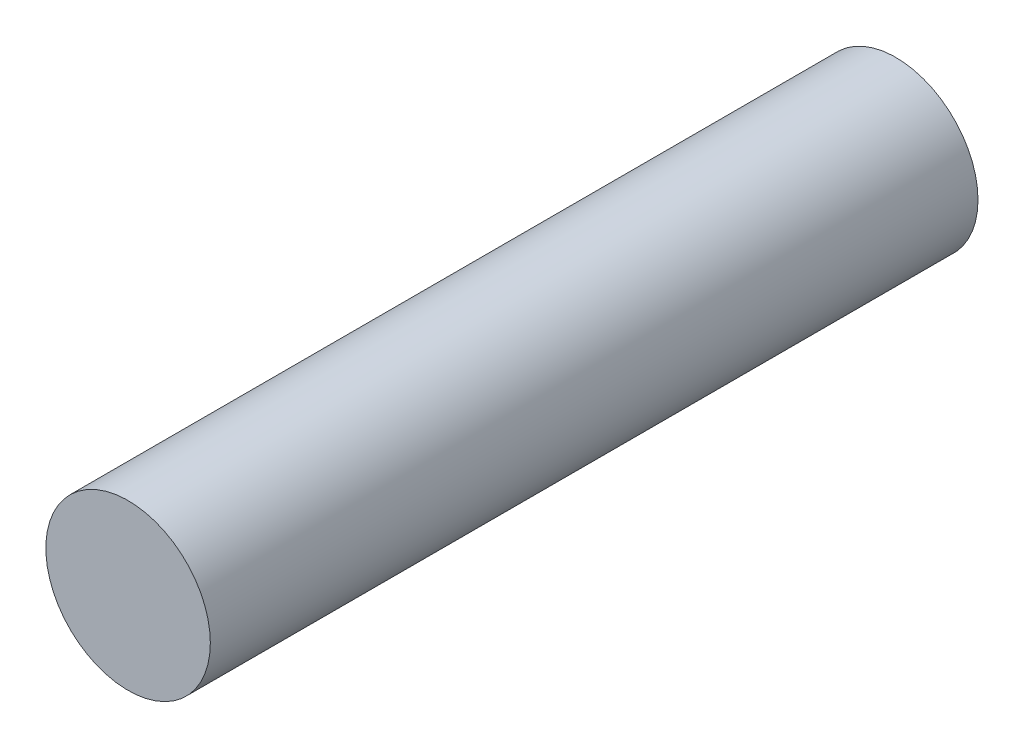
ISO-10303-21;
HEADER;
FILE_DESCRIPTION(('STEP AP214'),'2;1');
FILE_NAME('part.step','',(''),(''),'','','');
FILE_SCHEMA(('AUTOMOTIVE_DESIGN { 1 0 10303 214 1 1 1 1 }'));
ENDSEC;
DATA;
#1=APPLICATION_CONTEXT('core data for automotive mechanical design processes');
#2=APPLICATION_PROTOCOL_DEFINITION('international standard','automotive_design',2000,#1);
#3=PRODUCT_CONTEXT('',#1,'mechanical');
#4=PRODUCT('Part','Part','',(#3));
#5=PRODUCT_RELATED_PRODUCT_CATEGORY('part','',(#4));
#6=PRODUCT_DEFINITION_FORMATION('','',#4);
#7=PRODUCT_DEFINITION_CONTEXT('part definition',#1,'design');
#8=PRODUCT_DEFINITION('design','',#6,#7);
#9=PRODUCT_DEFINITION_SHAPE('','',#8);
#10=(LENGTH_UNIT() NAMED_UNIT(*) SI_UNIT(.MILLI.,.METRE.));
#11=(NAMED_UNIT(*) PLANE_ANGLE_UNIT() SI_UNIT($,.RADIAN.));
#12=(NAMED_UNIT(*) SI_UNIT($,.STERADIAN.) SOLID_ANGLE_UNIT());
#13=UNCERTAINTY_MEASURE_WITH_UNIT(LENGTH_MEASURE(1.E-05),#10,'distance_accuracy_value','');
#14=(GEOMETRIC_REPRESENTATION_CONTEXT(3) GLOBAL_UNCERTAINTY_ASSIGNED_CONTEXT((#13)) GLOBAL_UNIT_ASSIGNED_CONTEXT((#10,
#11,#12)) REPRESENTATION_CONTEXT('',''));
#15=CARTESIAN_POINT('',(0.,0.,0.));
#16=DIRECTION('',(0.,0.,1.));
#17=DIRECTION('',(1.,0.,0.));
#18=AXIS2_PLACEMENT_3D('',#15,#16,#17);
#19=CARTESIAN_POINT('',(0.,0.,70.));
#20=DIRECTION('',(0.,0.,-1.));
#21=DIRECTION('',(-1.,0.,0.));
#22=AXIS2_PLACEMENT_3D('',#19,#20,#21);
#23=CYLINDRICAL_SURFACE('',#22,7.5);
#24=CARTESIAN_POINT('',(0.,0.,70.));
#25=DIRECTION('',(0.,0.,1.));
#26=DIRECTION('',(1.,0.,0.));
#27=AXIS2_PLACEMENT_3D('',#24,#25,#26);
#28=CIRCLE('',#27,7.5);
#29=CARTESIAN_POINT('',(7.5,0.,70.));
#30=VERTEX_POINT('',#29);
#31=EDGE_CURVE('E10',#30,#30,#28,.T.);
#32=ORIENTED_EDGE('',*,*,#31,.F.);
#33=EDGE_LOOP('',(#32));
#34=FACE_BOUND('',#33,.T.);
#35=CARTESIAN_POINT('',(0.,0.,0.));
#36=DIRECTION('',(0.,0.,1.));
#37=DIRECTION('',(1.,0.,0.));
#38=AXIS2_PLACEMENT_3D('',#35,#36,#37);
#39=CIRCLE('',#38,7.5);
#40=CARTESIAN_POINT('',(7.5,0.,0.));
#41=VERTEX_POINT('',#40);
#42=EDGE_CURVE('E34',#41,#41,#39,.T.);
#43=ORIENTED_EDGE('',*,*,#42,.T.);
#44=EDGE_LOOP('',(#43));
#45=FACE_BOUND('',#44,.T.);
#46=ADVANCED_FACE('F31',(#34,#45),#23,.T.);
#47=CARTESIAN_POINT('',(0.,0.,70.));
#48=DIRECTION('',(0.,0.,1.));
#49=DIRECTION('',(1.,0.,0.));
#50=AXIS2_PLACEMENT_3D('',#47,#48,#49);
#51=PLANE('',#50);
#52=ORIENTED_EDGE('',*,*,#31,.T.);
#53=EDGE_LOOP('',(#52));
#54=FACE_BOUND('',#53,.T.);
#55=ADVANCED_FACE('F46',(#54),#51,.T.);
#56=CARTESIAN_POINT('',(0.,0.,0.));
#57=DIRECTION('',(0.,0.,1.));
#58=DIRECTION('',(1.,0.,0.));
#59=AXIS2_PLACEMENT_3D('',#56,#57,#58);
#60=PLANE('',#59);
#61=ORIENTED_EDGE('',*,*,#42,.F.);
#62=EDGE_LOOP('',(#61));
#63=FACE_BOUND('',#62,.T.);
#64=ADVANCED_FACE('F44',(#63),#60,.F.);
#65=CLOSED_SHELL('',(#46,#55,#64));
#66=MANIFOLD_SOLID_BREP('B2',#65);
#67=ADVANCED_BREP_SHAPE_REPRESENTATION('',(#18,#66),#14);
#68=SHAPE_DEFINITION_REPRESENTATION(#9,#67);
ENDSEC;
END-ISO-10303-21;
